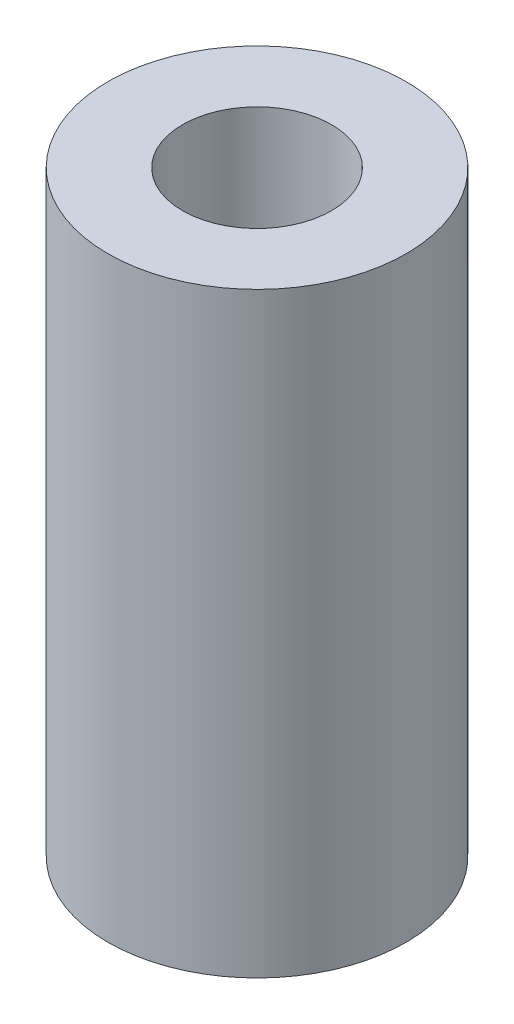
ISO-10303-21;
HEADER;
FILE_DESCRIPTION(('STEP AP214'),'2;1');
FILE_NAME('part.step','',(''),(''),'','','');
FILE_SCHEMA(('AUTOMOTIVE_DESIGN { 1 0 10303 214 1 1 1 1 }'));
ENDSEC;
DATA;
#1=APPLICATION_CONTEXT('core data for automotive mechanical design processes');
#2=APPLICATION_PROTOCOL_DEFINITION('international standard','automotive_design',2000,#1);
#3=PRODUCT_CONTEXT('',#1,'mechanical');
#4=PRODUCT('Part','Part','',(#3));
#5=PRODUCT_RELATED_PRODUCT_CATEGORY('part','',(#4));
#6=PRODUCT_DEFINITION_FORMATION('','',#4);
#7=PRODUCT_DEFINITION_CONTEXT('part definition',#1,'design');
#8=PRODUCT_DEFINITION('design','',#6,#7);
#9=PRODUCT_DEFINITION_SHAPE('','',#8);
#10=(LENGTH_UNIT() NAMED_UNIT(*) SI_UNIT(.MILLI.,.METRE.));
#11=(NAMED_UNIT(*) PLANE_ANGLE_UNIT() SI_UNIT($,.RADIAN.));
#12=(NAMED_UNIT(*) SI_UNIT($,.STERADIAN.) SOLID_ANGLE_UNIT());
#13=UNCERTAINTY_MEASURE_WITH_UNIT(LENGTH_MEASURE(1.E-05),#10,'distance_accuracy_value','');
#14=(GEOMETRIC_REPRESENTATION_CONTEXT(3) GLOBAL_UNCERTAINTY_ASSIGNED_CONTEXT((#13)) GLOBAL_UNIT_ASSIGNED_CONTEXT((#10,
#11,#12)) REPRESENTATION_CONTEXT('',''));
#15=CARTESIAN_POINT('',(0.,0.,0.));
#16=DIRECTION('',(0.,0.,1.));
#17=DIRECTION('',(1.,0.,0.));
#18=AXIS2_PLACEMENT_3D('',#15,#16,#17);
#19=CARTESIAN_POINT('',(0.,16.,0.));
#20=DIRECTION('',(0.,-1.,0.));
#21=DIRECTION('',(0.,0.,-1.));
#22=AXIS2_PLACEMENT_3D('',#19,#20,#21);
#23=CYLINDRICAL_SURFACE('',#22,4.);
#24=CARTESIAN_POINT('',(0.,16.,0.));
#25=DIRECTION('',(0.,1.,0.));
#26=DIRECTION('',(0.,0.,1.));
#27=AXIS2_PLACEMENT_3D('',#24,#25,#26);
#28=CIRCLE('',#27,4.);
#29=CARTESIAN_POINT('',(0.,16.,4.));
#30=VERTEX_POINT('',#29);
#31=EDGE_CURVE('E10',#30,#30,#28,.T.);
#32=ORIENTED_EDGE('',*,*,#31,.F.);
#33=EDGE_LOOP('',(#32));
#34=FACE_BOUND('',#33,.T.);
#35=CARTESIAN_POINT('',(0.,0.,0.));
#36=DIRECTION('',(0.,1.,0.));
#37=DIRECTION('',(0.,0.,1.));
#38=AXIS2_PLACEMENT_3D('',#35,#36,#37);
#39=CIRCLE('',#38,4.);
#40=CARTESIAN_POINT('',(0.,0.,4.));
#41=VERTEX_POINT('',#40);
#42=EDGE_CURVE('E34',#41,#41,#39,.T.);
#43=ORIENTED_EDGE('',*,*,#42,.T.);
#44=EDGE_LOOP('',(#43));
#45=FACE_BOUND('',#44,.T.);
#46=ADVANCED_FACE('F31',(#34,#45),#23,.T.);
#47=CARTESIAN_POINT('',(0.,16.,0.));
#48=DIRECTION('',(0.,1.,0.));
#49=DIRECTION('',(0.,0.,1.));
#50=AXIS2_PLACEMENT_3D('',#47,#48,#49);
#51=PLANE('',#50);
#52=CARTESIAN_POINT('',(0.,16.,0.));
#53=DIRECTION('',(0.,1.,0.));
#54=DIRECTION('',(0.,0.,1.));
#55=AXIS2_PLACEMENT_3D('',#52,#53,#54);
#56=CIRCLE('',#55,2.);
#57=CARTESIAN_POINT('',(0.,16.,2.));
#58=VERTEX_POINT('',#57);
#59=EDGE_CURVE('E45',#58,#58,#56,.T.);
#60=ORIENTED_EDGE('',*,*,#59,.F.);
#61=EDGE_LOOP('',(#60));
#62=FACE_BOUND('',#61,.T.);
#63=ORIENTED_EDGE('',*,*,#31,.T.);
#64=EDGE_LOOP('',(#63));
#65=FACE_BOUND('',#64,.T.);
#66=ADVANCED_FACE('F52',(#62,#65),#51,.T.);
#67=CARTESIAN_POINT('',(0.,0.,0.));
#68=DIRECTION('',(0.,1.,0.));
#69=DIRECTION('',(0.,0.,1.));
#70=AXIS2_PLACEMENT_3D('',#67,#68,#69);
#71=PLANE('',#70);
#72=CARTESIAN_POINT('',(0.,0.,0.));
#73=DIRECTION('',(0.,1.,0.));
#74=DIRECTION('',(0.,0.,1.));
#75=AXIS2_PLACEMENT_3D('',#72,#73,#74);
#76=CIRCLE('',#75,2.);
#77=CARTESIAN_POINT('',(0.,0.,2.));
#78=VERTEX_POINT('',#77);
#79=EDGE_CURVE('E41',#78,#78,#76,.F.);
#80=ORIENTED_EDGE('',*,*,#79,.F.);
#81=EDGE_LOOP('',(#80));
#82=FACE_BOUND('',#81,.T.);
#83=ORIENTED_EDGE('',*,*,#42,.F.);
#84=EDGE_LOOP('',(#83));
#85=FACE_BOUND('',#84,.T.);
#86=ADVANCED_FACE('F54',(#82,#85),#71,.F.);
#87=CARTESIAN_POINT('',(0.,-0.001000000000001,0.));
#88=DIRECTION('',(0.,1.,0.));
#89=DIRECTION('',(0.,0.,1.));
#90=AXIS2_PLACEMENT_3D('',#87,#88,#89);
#91=CYLINDRICAL_SURFACE('',#90,2.);
#92=ORIENTED_EDGE('',*,*,#59,.T.);
#93=EDGE_LOOP('',(#92));
#94=FACE_BOUND('',#93,.T.);
#95=ORIENTED_EDGE('',*,*,#79,.T.);
#96=EDGE_LOOP('',(#95));
#97=FACE_BOUND('',#96,.T.);
#98=ADVANCED_FACE('F49',(#94,#97),#91,.F.);
#99=CLOSED_SHELL('',(#46,#66,#86,#98));
#100=MANIFOLD_SOLID_BREP('B2',#99);
#101=ADVANCED_BREP_SHAPE_REPRESENTATION('',(#18,#100),#14);
#102=SHAPE_DEFINITION_REPRESENTATION(#9,#101);
ENDSEC;
END-ISO-10303-21;
